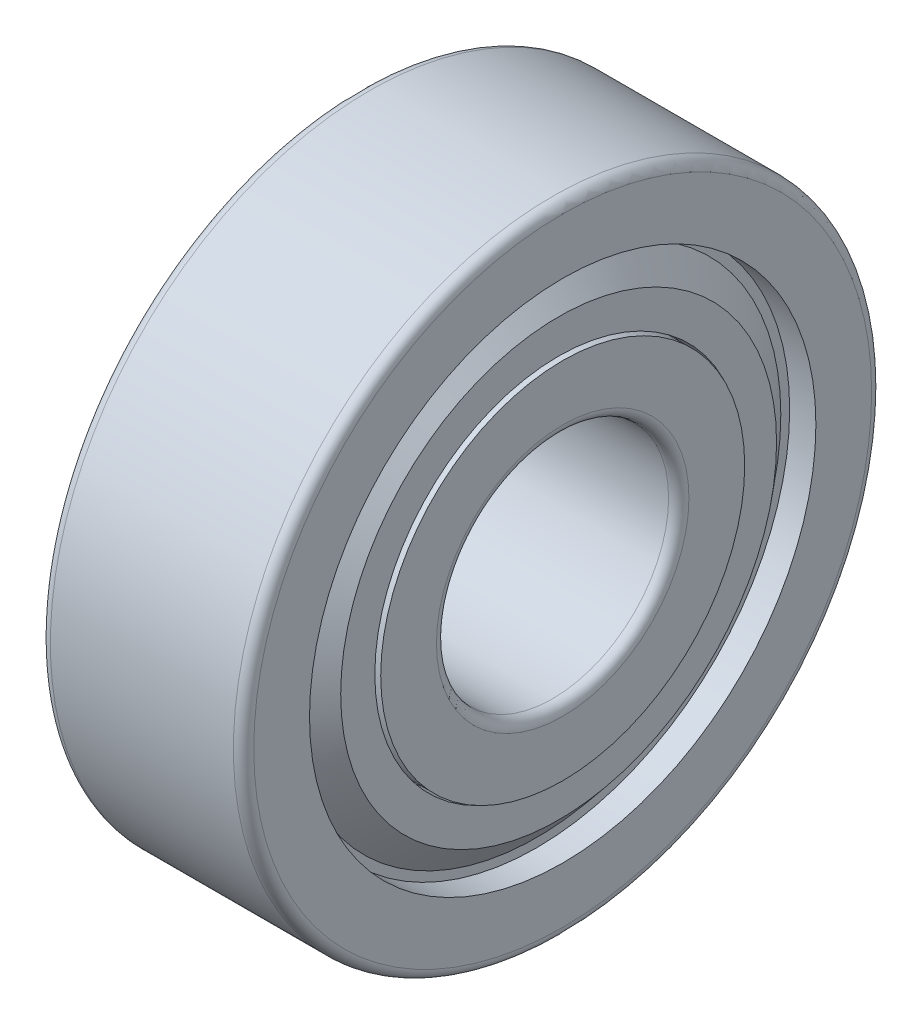
ISO-10303-21;
HEADER;
FILE_DESCRIPTION(('STEP AP214'),'2;1');
FILE_NAME('part.step','',(''),(''),'','','');
FILE_SCHEMA(('AUTOMOTIVE_DESIGN { 1 0 10303 214 1 1 1 1 }'));
ENDSEC;
DATA;
#1=APPLICATION_CONTEXT('core data for automotive mechanical design processes');
#2=APPLICATION_PROTOCOL_DEFINITION('international standard','automotive_design',2000,#1);
#3=PRODUCT_CONTEXT('',#1,'mechanical');
#4=PRODUCT('Part','Part','',(#3));
#5=PRODUCT_RELATED_PRODUCT_CATEGORY('part','',(#4));
#6=PRODUCT_DEFINITION_FORMATION('','',#4);
#7=PRODUCT_DEFINITION_CONTEXT('part definition',#1,'design');
#8=PRODUCT_DEFINITION('design','',#6,#7);
#9=PRODUCT_DEFINITION_SHAPE('','',#8);
#10=(LENGTH_UNIT() NAMED_UNIT(*) SI_UNIT(.MILLI.,.METRE.));
#11=(NAMED_UNIT(*) PLANE_ANGLE_UNIT() SI_UNIT($,.RADIAN.));
#12=(NAMED_UNIT(*) SI_UNIT($,.STERADIAN.) SOLID_ANGLE_UNIT());
#13=UNCERTAINTY_MEASURE_WITH_UNIT(LENGTH_MEASURE(1.E-05),#10,'distance_accuracy_value','');
#14=(GEOMETRIC_REPRESENTATION_CONTEXT(3) GLOBAL_UNCERTAINTY_ASSIGNED_CONTEXT((#13)) GLOBAL_UNIT_ASSIGNED_CONTEXT((#10,
#11,#12)) REPRESENTATION_CONTEXT('',''));
#15=CARTESIAN_POINT('',(0.,0.,0.));
#16=DIRECTION('',(0.,0.,1.));
#17=DIRECTION('',(1.,0.,0.));
#18=AXIS2_PLACEMENT_3D('',#15,#16,#17);
#19=CARTESIAN_POINT('',(-2.42662002530041,6.3352553,0.));
#20=DIRECTION('',(1.,0.,0.));
#21=DIRECTION('',(0.,0.,-1.));
#22=AXIS2_PLACEMENT_3D('',#19,#20,#21);
#23=PLANE('',#22);
#24=CARTESIAN_POINT('',(-2.42662002530041,0.,0.));
#25=DIRECTION('',(1.,0.,0.));
#26=DIRECTION('',(0.,0.,-1.));
#27=AXIS2_PLACEMENT_3D('',#24,#25,#26);
#28=CIRCLE('',#27,8.72617);
#29=CARTESIAN_POINT('',(-2.42662002530041,0.,-8.72617));
#30=VERTEX_POINT('',#29);
#31=EDGE_CURVE('P0_E10',#30,#30,#28,.T.);
#32=ORIENTED_EDGE('',*,*,#31,.T.);
#33=EDGE_LOOP('',(#32));
#34=FACE_BOUND('',#33,.T.);
#35=CARTESIAN_POINT('',(-2.42662002530041,0.,0.));
#36=DIRECTION('',(1.,0.,0.));
#37=DIRECTION('',(0.,0.,-1.));
#38=AXIS2_PLACEMENT_3D('',#35,#36,#37);
#39=CIRCLE('',#38,6.3352553);
#40=CARTESIAN_POINT('',(-2.42662002530041,0.,-6.3352553));
#41=VERTEX_POINT('',#40);
#42=EDGE_CURVE('P0_E97',#41,#41,#39,.T.);
#43=ORIENTED_EDGE('',*,*,#42,.F.);
#44=EDGE_LOOP('',(#43));
#45=FACE_BOUND('',#44,.T.);
#46=ADVANCED_FACE('P0_F33',(#34,#45),#23,.T.);
#47=CARTESIAN_POINT('',(-3.5064539936204,0.,0.));
#48=DIRECTION('',(1.,0.,0.));
#49=DIRECTION('',(0.,0.,-1.));
#50=AXIS2_PLACEMENT_3D('',#47,#48,#49);
#51=CYLINDRICAL_SURFACE('',#50,8.72617);
#52=CARTESIAN_POINT('',(-1.25160674638653,0.,0.));
#53=DIRECTION('',(1.,0.,0.));
#54=DIRECTION('',(0.,0.,-1.));
#55=AXIS2_PLACEMENT_3D('',#52,#53,#54);
#56=CIRCLE('',#55,8.72617);
#57=CARTESIAN_POINT('',(-1.25160674638653,0.,-8.72617));
#58=VERTEX_POINT('',#57);
#59=EDGE_CURVE('P0_E39',#58,#58,#56,.T.);
#60=ORIENTED_EDGE('',*,*,#59,.T.);
#61=EDGE_LOOP('',(#60));
#62=FACE_BOUND('',#61,.T.);
#63=ORIENTED_EDGE('',*,*,#31,.F.);
#64=EDGE_LOOP('',(#63));
#65=FACE_BOUND('',#64,.T.);
#66=ADVANCED_FACE('P0_F111',(#62,#65),#51,.F.);
#67=CARTESIAN_POINT('',(-1.25160674638653,8.72617,0.));
#68=CARTESIAN_POINT('',(-1.11429640152952,8.86625457147071,0.));
#69=CARTESIAN_POINT('',(-0.950906655480122,8.98456416318749,0.));
#70=CARTESIAN_POINT('',(-0.774967884148431,9.07130150642083,0.));
#71=CARTESIAN_POINT('',(-0.59902911281674,9.15803884965416,0.));
#72=CARTESIAN_POINT('',(-0.405688707660491,9.2155962674237,0.));
#73=CARTESIAN_POINT('',(-0.21095727169257,9.23920740493873,0.));
#74=CARTESIAN_POINT('',(-0.0162258357246483,9.26281854245376,0.));
#75=CARTESIAN_POINT('',(0.185267564490895,9.25313462403926,0.));
#76=CARTESIAN_POINT('',(0.376837172875498,9.21095757918958,0.));
#77=CARTESIAN_POINT('',(0.5684067812601,9.16878053433989,0.));
#78=CARTESIAN_POINT('',(0.755336324141104,9.09294706808271,0.));
#79=CARTESIAN_POINT('',(0.922146084797994,8.9897369827302,0.));
#80=CARTESIAN_POINT('',(1.041742863543,8.9157389523179,0.));
#81=CARTESIAN_POINT('',(1.15316001959653,8.82660575048484,0.));
#82=CARTESIAN_POINT('',(1.25160674638635,8.72617,0.));
#83=B_SPLINE_CURVE_WITH_KNOTS('',3,(#67,#68,#69,#70,#71,#72,#73,#74,#75,#76,#77,#78,#79,#80,#81,
#82),.UNSPECIFIED.,.F.,.F.,(4,3,3,3,3,4),(0.,0.000588472906530063,0.00117694581306013,
0.00176541871959019,0.00235389162612025,0.00277286392664262),.UNSPECIFIED.);
#84=CARTESIAN_POINT('',(-3.5064539936204,0.,0.));
#85=DIRECTION('',(1.,0.,0.));
#86=AXIS1_PLACEMENT('',#84,#85);
#87=SURFACE_OF_REVOLUTION('',#83,#86);
#88=CARTESIAN_POINT('',(1.25160674638635,0.,0.));
#89=DIRECTION('',(1.,0.,0.));
#90=DIRECTION('',(0.,0.,-1.));
#91=AXIS2_PLACEMENT_3D('',#88,#89,#90);
#92=CIRCLE('',#91,8.72617);
#93=CARTESIAN_POINT('',(1.25160674638635,0.,-8.72617));
#94=VERTEX_POINT('',#93);
#95=EDGE_CURVE('P0_E43',#94,#94,#92,.T.);
#96=ORIENTED_EDGE('',*,*,#95,.T.);
#97=EDGE_LOOP('',(#96));
#98=FACE_BOUND('',#97,.T.);
#99=ORIENTED_EDGE('',*,*,#59,.F.);
#100=EDGE_LOOP('',(#99));
#101=FACE_BOUND('',#100,.T.);
#102=ADVANCED_FACE('P0_F107',(#98,#101),#87,.F.);
#103=CARTESIAN_POINT('',(-3.5064539936204,0.,0.));
#104=DIRECTION('',(1.,0.,0.));
#105=DIRECTION('',(0.,0.,-1.));
#106=AXIS2_PLACEMENT_3D('',#103,#104,#105);
#107=CYLINDRICAL_SURFACE('',#106,8.72617);
#108=CARTESIAN_POINT('',(2.42662002530041,0.,0.));
#109=DIRECTION('',(1.,0.,0.));
#110=DIRECTION('',(0.,0.,-1.));
#111=AXIS2_PLACEMENT_3D('',#108,#109,#110);
#112=CIRCLE('',#111,8.72617);
#113=CARTESIAN_POINT('',(2.42662002530041,0.,-8.72617));
#114=VERTEX_POINT('',#113);
#115=EDGE_CURVE('P0_E47',#114,#114,#112,.T.);
#116=ORIENTED_EDGE('',*,*,#115,.T.);
#117=EDGE_LOOP('',(#116));
#118=FACE_BOUND('',#117,.T.);
#119=ORIENTED_EDGE('',*,*,#95,.F.);
#120=EDGE_LOOP('',(#119));
#121=FACE_BOUND('',#120,.T.);
#122=ADVANCED_FACE('P0_F110',(#118,#121),#107,.F.);
#123=CARTESIAN_POINT('',(2.42662002530041,8.72617,0.));
#124=DIRECTION('',(-1.,0.,0.));
#125=DIRECTION('',(0.,0.,1.));
#126=AXIS2_PLACEMENT_3D('',#123,#124,#125);
#127=PLANE('',#126);
#128=CARTESIAN_POINT('',(2.42662002530041,0.,0.));
#129=DIRECTION('',(1.,0.,0.));
#130=DIRECTION('',(0.,0.,-1.));
#131=AXIS2_PLACEMENT_3D('',#128,#129,#130);
#132=CIRCLE('',#131,6.3352553);
#133=CARTESIAN_POINT('',(2.42662002530041,0.,-6.3352553));
#134=VERTEX_POINT('',#133);
#135=EDGE_CURVE('P0_E52',#134,#134,#132,.T.);
#136=ORIENTED_EDGE('',*,*,#135,.T.);
#137=EDGE_LOOP('',(#136));
#138=FACE_BOUND('',#137,.T.);
#139=ORIENTED_EDGE('',*,*,#115,.F.);
#140=EDGE_LOOP('',(#139));
#141=FACE_BOUND('',#140,.T.);
#142=ADVANCED_FACE('P0_F211',(#138,#141),#127,.T.);
#143=CARTESIAN_POINT('',(-3.5064539936204,0.,0.));
#144=DIRECTION('',(1.,0.,0.));
#145=DIRECTION('',(0.,0.,-1.));
#146=AXIS2_PLACEMENT_3D('',#143,#144,#145);
#147=CYLINDRICAL_SURFACE('',#146,6.3352553);
#148=CARTESIAN_POINT('',(3.364992,0.,0.));
#149=DIRECTION('',(1.,0.,0.));
#150=DIRECTION('',(0.,0.,-1.));
#151=AXIS2_PLACEMENT_3D('',#148,#149,#150);
#152=CIRCLE('',#151,6.3352553);
#153=CARTESIAN_POINT('',(3.364992,0.,-6.3352553));
#154=VERTEX_POINT('',#153);
#155=EDGE_CURVE('P0_E55',#154,#154,#152,.T.);
#156=ORIENTED_EDGE('',*,*,#155,.T.);
#157=EDGE_LOOP('',(#156));
#158=FACE_BOUND('',#157,.T.);
#159=ORIENTED_EDGE('',*,*,#135,.F.);
#160=EDGE_LOOP('',(#159));
#161=FACE_BOUND('',#160,.T.);
#162=ADVANCED_FACE('P0_F205',(#158,#161),#147,.F.);
#163=CARTESIAN_POINT('',(3.364992,6.3352553,0.));
#164=DIRECTION('',(1.,0.,0.));
#165=DIRECTION('',(0.,0.,-1.));
#166=AXIS2_PLACEMENT_3D('',#163,#164,#165);
#167=PLANE('',#166);
#168=CARTESIAN_POINT('',(3.364992,0.,0.));
#169=DIRECTION('',(1.,0.,0.));
#170=DIRECTION('',(0.,0.,-1.));
#171=AXIS2_PLACEMENT_3D('',#168,#169,#170);
#172=CIRCLE('',#171,7.51131261260058);
#173=CARTESIAN_POINT('',(3.364992,0.,-7.51131261260058));
#174=VERTEX_POINT('',#173);
#175=EDGE_CURVE('P0_E58',#174,#174,#172,.T.);
#176=ORIENTED_EDGE('',*,*,#175,.T.);
#177=EDGE_LOOP('',(#176));
#178=FACE_BOUND('',#177,.T.);
#179=ORIENTED_EDGE('',*,*,#155,.F.);
#180=EDGE_LOOP('',(#179));
#181=FACE_BOUND('',#180,.T.);
#182=ADVANCED_FACE('P0_F199',(#178,#181),#167,.T.);
#183=CARTESIAN_POINT('',(3.364992,0.,0.));
#184=DIRECTION('',(-1.,0.,0.));
#185=DIRECTION('',(0.,0.,1.));
#186=AXIS2_PLACEMENT_3D('',#183,#184,#185);
#187=CONICAL_SURFACE('',#186,7.51131261260058,0.872664625997);
#188=CARTESIAN_POINT('',(2.6018800253,0.,0.));
#189=DIRECTION('',(1.,0.,0.));
#190=DIRECTION('',(0.,0.,-1.));
#191=AXIS2_PLACEMENT_3D('',#188,#189,#190);
#192=CIRCLE('',#191,8.42075405000067);
#193=CARTESIAN_POINT('',(2.6018800253,0.,-8.42075405000067));
#194=VERTEX_POINT('',#193);
#195=EDGE_CURVE('P0_E61',#194,#194,#192,.T.);
#196=ORIENTED_EDGE('',*,*,#195,.T.);
#197=EDGE_LOOP('',(#196));
#198=FACE_BOUND('',#197,.T.);
#199=ORIENTED_EDGE('',*,*,#175,.F.);
#200=EDGE_LOOP('',(#199));
#201=FACE_BOUND('',#200,.T.);
#202=ADVANCED_FACE('P0_F193',(#198,#201),#187,.T.);
#203=CARTESIAN_POINT('',(2.60188002529995,8.42075405000067,0.));
#204=DIRECTION('',(1.,0.,0.));
#205=DIRECTION('',(0.,0.,-1.));
#206=AXIS2_PLACEMENT_3D('',#203,#204,#205);
#207=PLANE('',#206);
#208=CARTESIAN_POINT('',(2.6018800252999,0.,0.));
#209=DIRECTION('',(1.,0.,0.));
#210=DIRECTION('',(0.,0.,-1.));
#211=AXIS2_PLACEMENT_3D('',#208,#209,#210);
#212=CIRCLE('',#211,8.72617);
#213=CARTESIAN_POINT('',(2.6018800252999,0.,-8.72617));
#214=VERTEX_POINT('',#213);
#215=EDGE_CURVE('P0_E64',#214,#214,#212,.T.);
#216=ORIENTED_EDGE('',*,*,#215,.T.);
#217=EDGE_LOOP('',(#216));
#218=FACE_BOUND('',#217,.T.);
#219=ORIENTED_EDGE('',*,*,#195,.F.);
#220=EDGE_LOOP('',(#219));
#221=FACE_BOUND('',#220,.T.);
#222=ADVANCED_FACE('P0_F187',(#218,#221),#207,.T.);
#223=CARTESIAN_POINT('',(-3.5064539936204,0.,0.));
#224=DIRECTION('',(1.,0.,0.));
#225=DIRECTION('',(0.,0.,-1.));
#226=AXIS2_PLACEMENT_3D('',#223,#224,#225);
#227=CYLINDRICAL_SURFACE('',#226,8.72617);
#228=CARTESIAN_POINT('',(3.5052,0.,0.));
#229=DIRECTION('',(1.,0.,0.));
#230=DIRECTION('',(0.,0.,-1.));
#231=AXIS2_PLACEMENT_3D('',#228,#229,#230);
#232=CIRCLE('',#231,8.72617);
#233=CARTESIAN_POINT('',(3.5052,0.,-8.72617));
#234=VERTEX_POINT('',#233);
#235=EDGE_CURVE('P0_E67',#234,#234,#232,.T.);
#236=ORIENTED_EDGE('',*,*,#235,.T.);
#237=EDGE_LOOP('',(#236));
#238=FACE_BOUND('',#237,.T.);
#239=ORIENTED_EDGE('',*,*,#215,.F.);
#240=EDGE_LOOP('',(#239));
#241=FACE_BOUND('',#240,.T.);
#242=ADVANCED_FACE('P0_F181',(#238,#241),#227,.F.);
#243=CARTESIAN_POINT('',(3.5052,8.72617,0.));
#244=DIRECTION('',(1.,0.,0.));
#245=DIRECTION('',(0.,0.,-1.));
#246=AXIS2_PLACEMENT_3D('',#243,#244,#245);
#247=PLANE('',#246);
#248=CARTESIAN_POINT('',(3.5052,0.,0.));
#249=DIRECTION('',(1.,0.,0.));
#250=DIRECTION('',(0.,0.,-1.));
#251=AXIS2_PLACEMENT_3D('',#248,#249,#250);
#252=CIRCLE('',#251,10.64768);
#253=CARTESIAN_POINT('',(3.5052,0.,-10.64768));
#254=VERTEX_POINT('',#253);
#255=EDGE_CURVE('P0_E70',#254,#254,#252,.T.);
#256=ORIENTED_EDGE('',*,*,#255,.T.);
#257=EDGE_LOOP('',(#256));
#258=FACE_BOUND('',#257,.T.);
#259=ORIENTED_EDGE('',*,*,#235,.F.);
#260=EDGE_LOOP('',(#259));
#261=FACE_BOUND('',#260,.T.);
#262=ADVANCED_FACE('P0_F175',(#258,#261),#247,.T.);
#263=CARTESIAN_POINT('',(3.15468,0.,0.));
#264=DIRECTION('',(1.,0.,0.));
#265=DIRECTION('',(0.,0.,-1.));
#266=AXIS2_PLACEMENT_3D('',#263,#264,#265);
#267=TOROIDAL_SURFACE('',#266,10.64768,0.35052);
#268=CARTESIAN_POINT('',(3.15468,0.,0.));
#269=DIRECTION('',(1.,0.,0.));
#270=DIRECTION('',(0.,0.,-1.));
#271=AXIS2_PLACEMENT_3D('',#268,#269,#270);
#272=CIRCLE('',#271,10.9982);
#273=CARTESIAN_POINT('',(3.15468,0.,-10.9982));
#274=VERTEX_POINT('',#273);
#275=EDGE_CURVE('P0_E73',#274,#274,#272,.T.);
#276=ORIENTED_EDGE('',*,*,#275,.T.);
#277=EDGE_LOOP('',(#276));
#278=FACE_BOUND('',#277,.T.);
#279=ORIENTED_EDGE('',*,*,#255,.F.);
#280=EDGE_LOOP('',(#279));
#281=FACE_BOUND('',#280,.T.);
#282=ADVANCED_FACE('P0_F169',(#278,#281),#267,.T.);
#283=CARTESIAN_POINT('',(-3.5064539936204,0.,0.));
#284=DIRECTION('',(1.,0.,0.));
#285=DIRECTION('',(0.,0.,-1.));
#286=AXIS2_PLACEMENT_3D('',#283,#284,#285);
#287=CYLINDRICAL_SURFACE('',#286,10.9982);
#288=CARTESIAN_POINT('',(-3.15468,0.,0.));
#289=DIRECTION('',(1.,0.,0.));
#290=DIRECTION('',(0.,0.,-1.));
#291=AXIS2_PLACEMENT_3D('',#288,#289,#290);
#292=CIRCLE('',#291,10.9982);
#293=CARTESIAN_POINT('',(-3.15468,0.,-10.9982));
#294=VERTEX_POINT('',#293);
#295=EDGE_CURVE('P0_E76',#294,#294,#292,.T.);
#296=ORIENTED_EDGE('',*,*,#295,.T.);
#297=EDGE_LOOP('',(#296));
#298=FACE_BOUND('',#297,.T.);
#299=ORIENTED_EDGE('',*,*,#275,.F.);
#300=EDGE_LOOP('',(#299));
#301=FACE_BOUND('',#300,.T.);
#302=ADVANCED_FACE('P0_F163',(#298,#301),#287,.T.);
#303=CARTESIAN_POINT('',(-3.15468,0.,0.));
#304=DIRECTION('',(1.,0.,0.));
#305=DIRECTION('',(0.,0.,-1.));
#306=AXIS2_PLACEMENT_3D('',#303,#304,#305);
#307=TOROIDAL_SURFACE('',#306,10.64768,0.35052);
#308=CARTESIAN_POINT('',(-3.5052,0.,0.));
#309=DIRECTION('',(1.,0.,0.));
#310=DIRECTION('',(0.,0.,-1.));
#311=AXIS2_PLACEMENT_3D('',#308,#309,#310);
#312=CIRCLE('',#311,10.64768);
#313=CARTESIAN_POINT('',(-3.5052,0.,-10.64768));
#314=VERTEX_POINT('',#313);
#315=EDGE_CURVE('P0_E79',#314,#314,#312,.T.);
#316=ORIENTED_EDGE('',*,*,#315,.T.);
#317=EDGE_LOOP('',(#316));
#318=FACE_BOUND('',#317,.T.);
#319=ORIENTED_EDGE('',*,*,#295,.F.);
#320=EDGE_LOOP('',(#319));
#321=FACE_BOUND('',#320,.T.);
#322=ADVANCED_FACE('P0_F157',(#318,#321),#307,.T.);
#323=CARTESIAN_POINT('',(-3.5052,10.64768,0.));
#324=DIRECTION('',(-1.,0.,0.));
#325=DIRECTION('',(0.,0.,1.));
#326=AXIS2_PLACEMENT_3D('',#323,#324,#325);
#327=PLANE('',#326);
#328=CARTESIAN_POINT('',(-3.5052,0.,0.));
#329=DIRECTION('',(1.,0.,0.));
#330=DIRECTION('',(0.,0.,-1.));
#331=AXIS2_PLACEMENT_3D('',#328,#329,#330);
#332=CIRCLE('',#331,8.72617);
#333=CARTESIAN_POINT('',(-3.5052,0.,-8.72617));
#334=VERTEX_POINT('',#333);
#335=EDGE_CURVE('P0_E82',#334,#334,#332,.T.);
#336=ORIENTED_EDGE('',*,*,#335,.T.);
#337=EDGE_LOOP('',(#336));
#338=FACE_BOUND('',#337,.T.);
#339=ORIENTED_EDGE('',*,*,#315,.F.);
#340=EDGE_LOOP('',(#339));
#341=FACE_BOUND('',#340,.T.);
#342=ADVANCED_FACE('P0_F151',(#338,#341),#327,.T.);
#343=CARTESIAN_POINT('',(-3.5064539936204,0.,0.));
#344=DIRECTION('',(1.,0.,0.));
#345=DIRECTION('',(0.,0.,-1.));
#346=AXIS2_PLACEMENT_3D('',#343,#344,#345);
#347=CYLINDRICAL_SURFACE('',#346,8.72617);
#348=CARTESIAN_POINT('',(-2.6018800252999,0.,0.));
#349=DIRECTION('',(1.,0.,0.));
#350=DIRECTION('',(0.,0.,-1.));
#351=AXIS2_PLACEMENT_3D('',#348,#349,#350);
#352=CIRCLE('',#351,8.72617);
#353=CARTESIAN_POINT('',(-2.6018800252999,0.,-8.72617));
#354=VERTEX_POINT('',#353);
#355=EDGE_CURVE('P0_E85',#354,#354,#352,.T.);
#356=ORIENTED_EDGE('',*,*,#355,.T.);
#357=EDGE_LOOP('',(#356));
#358=FACE_BOUND('',#357,.T.);
#359=ORIENTED_EDGE('',*,*,#335,.F.);
#360=EDGE_LOOP('',(#359));
#361=FACE_BOUND('',#360,.T.);
#362=ADVANCED_FACE('P0_F145',(#358,#361),#347,.F.);
#363=CARTESIAN_POINT('',(-2.6018800252999,8.72617,0.));
#364=DIRECTION('',(-1.,0.,0.));
#365=DIRECTION('',(0.,0.,1.));
#366=AXIS2_PLACEMENT_3D('',#363,#364,#365);
#367=PLANE('',#366);
#368=CARTESIAN_POINT('',(-2.6018800252999,0.,0.));
#369=DIRECTION('',(1.,0.,0.));
#370=DIRECTION('',(0.,0.,-1.));
#371=AXIS2_PLACEMENT_3D('',#368,#369,#370);
#372=CIRCLE('',#371,8.42075405000067);
#373=CARTESIAN_POINT('',(-2.6018800252999,0.,-8.42075405000067));
#374=VERTEX_POINT('',#373);
#375=EDGE_CURVE('P0_E88',#374,#374,#372,.T.);
#376=ORIENTED_EDGE('',*,*,#375,.T.);
#377=EDGE_LOOP('',(#376));
#378=FACE_BOUND('',#377,.T.);
#379=ORIENTED_EDGE('',*,*,#355,.F.);
#380=EDGE_LOOP('',(#379));
#381=FACE_BOUND('',#380,.T.);
#382=ADVANCED_FACE('P0_F139',(#378,#381),#367,.T.);
#383=CARTESIAN_POINT('',(-2.6018800252999,0.,0.));
#384=DIRECTION('',(1.,0.,0.));
#385=DIRECTION('',(0.,0.,-1.));
#386=AXIS2_PLACEMENT_3D('',#383,#384,#385);
#387=CONICAL_SURFACE('',#386,8.42075405000067,0.872664625997);
#388=CARTESIAN_POINT('',(-3.3649919999999,0.,0.));
#389=DIRECTION('',(1.,0.,0.));
#390=DIRECTION('',(0.,0.,-1.));
#391=AXIS2_PLACEMENT_3D('',#388,#389,#390);
#392=CIRCLE('',#391,7.51131261260058);
#393=CARTESIAN_POINT('',(-3.3649919999999,0.,-7.51131261260058));
#394=VERTEX_POINT('',#393);
#395=EDGE_CURVE('P0_E91',#394,#394,#392,.T.);
#396=ORIENTED_EDGE('',*,*,#395,.T.);
#397=EDGE_LOOP('',(#396));
#398=FACE_BOUND('',#397,.T.);
#399=ORIENTED_EDGE('',*,*,#375,.F.);
#400=EDGE_LOOP('',(#399));
#401=FACE_BOUND('',#400,.T.);
#402=ADVANCED_FACE('P0_F133',(#398,#401),#387,.T.);
#403=CARTESIAN_POINT('',(-3.36499199999995,7.51131261260058,0.));
#404=DIRECTION('',(-1.,0.,0.));
#405=DIRECTION('',(0.,0.,1.));
#406=AXIS2_PLACEMENT_3D('',#403,#404,#405);
#407=PLANE('',#406);
#408=CARTESIAN_POINT('',(-3.364992,0.,0.));
#409=DIRECTION('',(1.,0.,0.));
#410=DIRECTION('',(0.,0.,-1.));
#411=AXIS2_PLACEMENT_3D('',#408,#409,#410);
#412=CIRCLE('',#411,6.3352553);
#413=CARTESIAN_POINT('',(-3.364992,0.,-6.3352553));
#414=VERTEX_POINT('',#413);
#415=EDGE_CURVE('P0_E94',#414,#414,#412,.T.);
#416=ORIENTED_EDGE('',*,*,#415,.T.);
#417=EDGE_LOOP('',(#416));
#418=FACE_BOUND('',#417,.T.);
#419=ORIENTED_EDGE('',*,*,#395,.F.);
#420=EDGE_LOOP('',(#419));
#421=FACE_BOUND('',#420,.T.);
#422=ADVANCED_FACE('P0_F127',(#418,#421),#407,.T.);
#423=CARTESIAN_POINT('',(-3.5064539936204,0.,0.));
#424=DIRECTION('',(1.,0.,0.));
#425=DIRECTION('',(0.,0.,-1.));
#426=AXIS2_PLACEMENT_3D('',#423,#424,#425);
#427=CYLINDRICAL_SURFACE('',#426,6.3352553);
#428=ORIENTED_EDGE('',*,*,#42,.T.);
#429=EDGE_LOOP('',(#428));
#430=FACE_BOUND('',#429,.T.);
#431=ORIENTED_EDGE('',*,*,#415,.F.);
#432=EDGE_LOOP('',(#431));
#433=FACE_BOUND('',#432,.T.);
#434=ADVANCED_FACE('P0_F124',(#430,#433),#427,.F.);
#435=CLOSED_SHELL('',(#46,#66,#102,#122,#142,#162,#182,#202,#222,#242,#262,#282,#302,#322,#342,
#362,#382,#402,#422,#434));
#436=MANIFOLD_SOLID_BREP('P0_B2',#435);
#437=CARTESIAN_POINT('',(0.,0.,0.));
#438=DIRECTION('',(1.,0.,0.));
#439=DIRECTION('',(0.,-1.,0.));
#440=AXIS2_PLACEMENT_3D('',#437,#438,#439);
#441=TOROIDAL_SURFACE('',#440,7.49935,1.7526);
#442=CARTESIAN_POINT('',(1.25160674638653,0.,0.));
#443=DIRECTION('',(1.,0.,0.));
#444=DIRECTION('',(0.,0.,-1.));
#445=AXIS2_PLACEMENT_3D('',#442,#443,#444);
#446=CIRCLE('',#445,6.27253);
#447=CARTESIAN_POINT('',(1.25160674638653,0.,-6.27253));
#448=VERTEX_POINT('',#447);
#449=EDGE_CURVE('P1_E242',#448,#448,#446,.T.);
#450=ORIENTED_EDGE('',*,*,#449,.F.);
#451=EDGE_LOOP('',(#450));
#452=FACE_BOUND('',#451,.T.);
#453=CARTESIAN_POINT('',(-1.25160674638653,0.,0.));
#454=DIRECTION('',(1.,0.,0.));
#455=DIRECTION('',(0.,0.,-1.));
#456=AXIS2_PLACEMENT_3D('',#453,#454,#455);
#457=CIRCLE('',#456,6.27253);
#458=CARTESIAN_POINT('',(-1.25160674638653,0.,-6.27253));
#459=VERTEX_POINT('',#458);
#460=EDGE_CURVE('P1_E245',#459,#459,#457,.F.);
#461=ORIENTED_EDGE('',*,*,#460,.F.);
#462=EDGE_LOOP('',(#461));
#463=FACE_BOUND('',#462,.T.);
#464=ADVANCED_FACE('P1_F16',(#452,#463),#441,.F.);
#465=CARTESIAN_POINT('',(-3.85572,0.,0.));
#466=DIRECTION('',(1.,0.,0.));
#467=DIRECTION('',(0.,0.,-1.));
#468=AXIS2_PLACEMENT_3D('',#465,#466,#467);
#469=CYLINDRICAL_SURFACE('',#468,6.27253);
#470=ORIENTED_EDGE('',*,*,#460,.T.);
#471=EDGE_LOOP('',(#470));
#472=FACE_BOUND('',#471,.T.);
#473=CARTESIAN_POINT('',(-3.5052,0.,0.));
#474=DIRECTION('',(1.,0.,0.));
#475=DIRECTION('',(0.,0.,-1.));
#476=AXIS2_PLACEMENT_3D('',#473,#474,#475);
#477=CIRCLE('',#476,6.27253);
#478=CARTESIAN_POINT('',(-3.5052,0.,-6.27253));
#479=VERTEX_POINT('',#478);
#480=EDGE_CURVE('P1_E58',#479,#479,#477,.T.);
#481=ORIENTED_EDGE('',*,*,#480,.T.);
#482=EDGE_LOOP('',(#481));
#483=FACE_BOUND('',#482,.T.);
#484=ADVANCED_FACE('P1_F201',(#472,#483),#469,.T.);
#485=CARTESIAN_POINT('',(-3.85572,0.,0.));
#486=DIRECTION('',(1.,0.,0.));
#487=DIRECTION('',(0.,0.,-1.));
#488=AXIS2_PLACEMENT_3D('',#485,#486,#487);
#489=CYLINDRICAL_SURFACE('',#488,6.27253);
#490=CARTESIAN_POINT('',(3.5052,0.,0.));
#491=DIRECTION('',(1.,0.,0.));
#492=DIRECTION('',(0.,0.,-1.));
#493=AXIS2_PLACEMENT_3D('',#490,#491,#492);
#494=CIRCLE('',#493,6.27253);
#495=CARTESIAN_POINT('',(3.5052,0.,-6.27253));
#496=VERTEX_POINT('',#495);
#497=EDGE_CURVE('P1_E57',#496,#496,#494,.T.);
#498=ORIENTED_EDGE('',*,*,#497,.F.);
#499=EDGE_LOOP('',(#498));
#500=FACE_BOUND('',#499,.T.);
#501=ORIENTED_EDGE('',*,*,#449,.T.);
#502=EDGE_LOOP('',(#501));
#503=FACE_BOUND('',#502,.T.);
#504=ADVANCED_FACE('P1_F85',(#500,#503),#489,.T.);
#505=CARTESIAN_POINT('',(-3.5052,0.,0.));
#506=DIRECTION('',(1.,0.,0.));
#507=DIRECTION('',(0.,0.,-1.));
#508=AXIS2_PLACEMENT_3D('',#505,#506,#507);
#509=PLANE('',#508);
#510=CARTESIAN_POINT('',(-3.5052,0.,0.));
#511=DIRECTION('',(-1.,0.,0.));
#512=DIRECTION('',(0.,-1.,0.));
#513=AXIS2_PLACEMENT_3D('',#510,#511,#512);
#514=CIRCLE('',#513,4.35102);
#515=CARTESIAN_POINT('',(-3.5052,-4.35102,0.));
#516=VERTEX_POINT('',#515);
#517=CARTESIAN_POINT('',(-3.5052,4.35102,0.));
#518=VERTEX_POINT('',#517);
#519=EDGE_CURVE('P1_E52',#516,#518,#514,.T.);
#520=ORIENTED_EDGE('',*,*,#519,.F.);
#521=CARTESIAN_POINT('',(-3.5052,0.,0.));
#522=DIRECTION('',(-1.,0.,0.));
#523=DIRECTION('',(0.,1.,0.));
#524=AXIS2_PLACEMENT_3D('',#521,#522,#523);
#525=CIRCLE('',#524,4.35102);
#526=EDGE_CURVE('P1_E47',#518,#516,#525,.T.);
#527=ORIENTED_EDGE('',*,*,#526,.F.);
#528=EDGE_LOOP('',(#520,#527));
#529=FACE_BOUND('',#528,.T.);
#530=ORIENTED_EDGE('',*,*,#480,.F.);
#531=EDGE_LOOP('',(#530));
#532=FACE_BOUND('',#531,.T.);
#533=ADVANCED_FACE('P1_F62',(#529,#532),#509,.F.);
#534=CARTESIAN_POINT('',(3.5052,0.,0.));
#535=DIRECTION('',(1.,0.,0.));
#536=DIRECTION('',(0.,0.,-1.));
#537=AXIS2_PLACEMENT_3D('',#534,#535,#536);
#538=PLANE('',#537);
#539=CARTESIAN_POINT('',(3.5052,0.,0.));
#540=DIRECTION('',(1.,0.,0.));
#541=DIRECTION('',(0.,1.,0.));
#542=AXIS2_PLACEMENT_3D('',#539,#540,#541);
#543=CIRCLE('',#542,4.35102);
#544=CARTESIAN_POINT('',(3.5052,4.35102,0.));
#545=VERTEX_POINT('',#544);
#546=CARTESIAN_POINT('',(3.5052,-4.35102,0.));
#547=VERTEX_POINT('',#546);
#548=EDGE_CURVE('P1_E65',#545,#547,#543,.T.);
#549=ORIENTED_EDGE('',*,*,#548,.F.);
#550=CARTESIAN_POINT('',(3.5052,0.,0.));
#551=DIRECTION('',(1.,0.,0.));
#552=DIRECTION('',(0.,-1.,0.));
#553=AXIS2_PLACEMENT_3D('',#550,#551,#552);
#554=CIRCLE('',#553,4.35102);
#555=EDGE_CURVE('P1_E35',#545,#547,#554,.F.);
#556=ORIENTED_EDGE('',*,*,#555,.T.);
#557=EDGE_LOOP('',(#549,#556));
#558=FACE_BOUND('',#557,.T.);
#559=ORIENTED_EDGE('',*,*,#497,.T.);
#560=EDGE_LOOP('',(#559));
#561=FACE_BOUND('',#560,.T.);
#562=ADVANCED_FACE('P1_F84',(#558,#561),#538,.T.);
#563=CARTESIAN_POINT('',(-3.15468,0.,0.));
#564=DIRECTION('',(1.,0.,0.));
#565=DIRECTION('',(0.,-1.,0.));
#566=AXIS2_PLACEMENT_3D('',#563,#564,#565);
#567=TOROIDAL_SURFACE('',#566,4.35102,0.35052);
#568=ORIENTED_EDGE('',*,*,#526,.T.);
#569=ORIENTED_EDGE('',*,*,#519,.T.);
#570=EDGE_LOOP('',(#568,#569));
#571=FACE_BOUND('',#570,.T.);
#572=CARTESIAN_POINT('',(-3.15468,0.,0.));
#573=DIRECTION('',(1.,0.,0.));
#574=DIRECTION('',(0.,0.,-1.));
#575=AXIS2_PLACEMENT_3D('',#572,#573,#574);
#576=CIRCLE('',#575,4.0005);
#577=CARTESIAN_POINT('',(-3.15468,0.,-4.0005));
#578=VERTEX_POINT('',#577);
#579=EDGE_CURVE('P1_E28',#578,#578,#576,.T.);
#580=ORIENTED_EDGE('',*,*,#579,.T.);
#581=EDGE_LOOP('',(#580));
#582=FACE_BOUND('',#581,.T.);
#583=ADVANCED_FACE('P1_F50',(#571,#582),#567,.T.);
#584=CARTESIAN_POINT('',(3.15468,0.,0.));
#585=DIRECTION('',(1.,0.,0.));
#586=DIRECTION('',(0.,-1.,0.));
#587=AXIS2_PLACEMENT_3D('',#584,#585,#586);
#588=TOROIDAL_SURFACE('',#587,4.35102,0.35052);
#589=ORIENTED_EDGE('',*,*,#548,.T.);
#590=ORIENTED_EDGE('',*,*,#555,.F.);
#591=EDGE_LOOP('',(#589,#590));
#592=FACE_BOUND('',#591,.T.);
#593=CARTESIAN_POINT('',(3.15468,0.,0.));
#594=DIRECTION('',(1.,0.,0.));
#595=DIRECTION('',(0.,0.,-1.));
#596=AXIS2_PLACEMENT_3D('',#593,#594,#595);
#597=CIRCLE('',#596,4.0005);
#598=CARTESIAN_POINT('',(3.15468,0.,-4.0005));
#599=VERTEX_POINT('',#598);
#600=EDGE_CURVE('P1_E11',#599,#599,#597,.F.);
#601=ORIENTED_EDGE('',*,*,#600,.T.);
#602=EDGE_LOOP('',(#601));
#603=FACE_BOUND('',#602,.T.);
#604=ADVANCED_FACE('P1_F109',(#592,#603),#588,.T.);
#605=CARTESIAN_POINT('',(-3.85572,0.,0.));
#606=DIRECTION('',(1.,0.,0.));
#607=DIRECTION('',(0.,0.,-1.));
#608=AXIS2_PLACEMENT_3D('',#605,#606,#607);
#609=CYLINDRICAL_SURFACE('',#608,4.0005);
#610=ORIENTED_EDGE('',*,*,#579,.F.);
#611=EDGE_LOOP('',(#610));
#612=FACE_BOUND('',#611,.T.);
#613=ORIENTED_EDGE('',*,*,#600,.F.);
#614=EDGE_LOOP('',(#613));
#615=FACE_BOUND('',#614,.T.);
#616=ADVANCED_FACE('P1_F140',(#612,#615),#609,.F.);
#617=CLOSED_SHELL('',(#464,#484,#504,#533,#562,#583,#604,#616));
#618=MANIFOLD_SOLID_BREP('P1_B1',#617);
#619=ADVANCED_BREP_SHAPE_REPRESENTATION('',(#18,#436,#618),#14);
#620=SHAPE_DEFINITION_REPRESENTATION(#9,#619);
ENDSEC;
END-ISO-10303-21;
